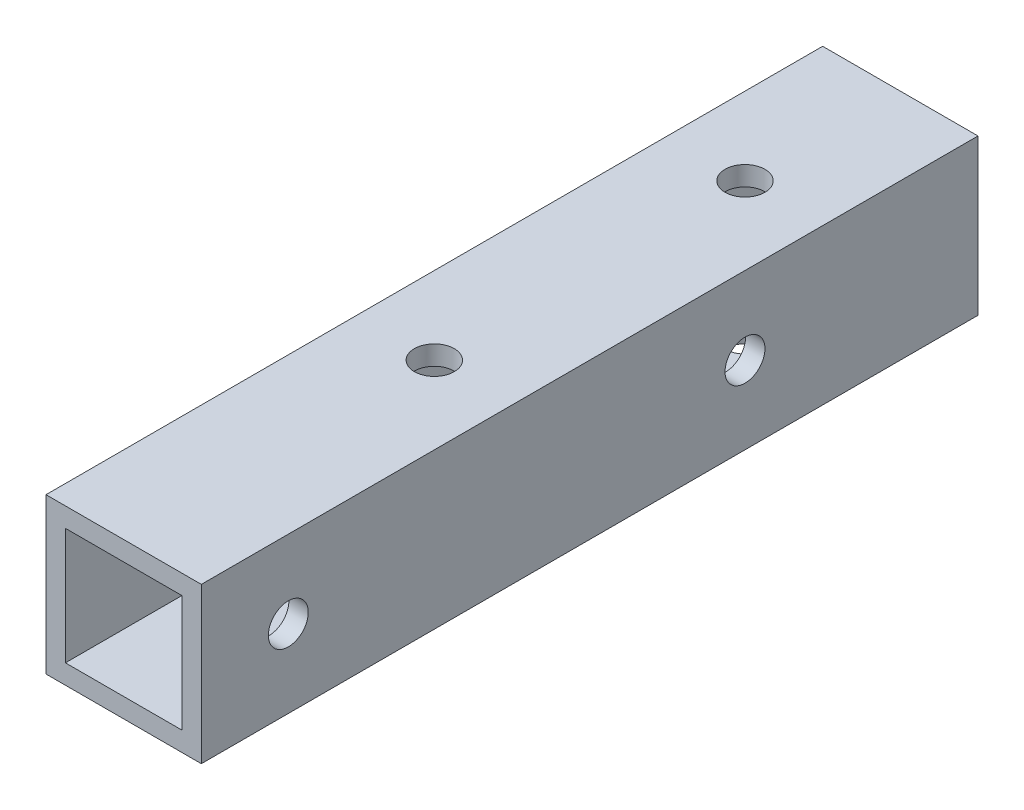
ISO-10303-21;
HEADER;
FILE_DESCRIPTION(('STEP AP214'),'2;1');
FILE_NAME('part.step','',(''),(''),'','','');
FILE_SCHEMA(('AUTOMOTIVE_DESIGN { 1 0 10303 214 1 1 1 1 }'));
ENDSEC;
DATA;
#1=APPLICATION_CONTEXT('core data for automotive mechanical design processes');
#2=APPLICATION_PROTOCOL_DEFINITION('international standard','automotive_design',2000,#1);
#3=PRODUCT_CONTEXT('',#1,'mechanical');
#4=PRODUCT('Part','Part','',(#3));
#5=PRODUCT_RELATED_PRODUCT_CATEGORY('part','',(#4));
#6=PRODUCT_DEFINITION_FORMATION('','',#4);
#7=PRODUCT_DEFINITION_CONTEXT('part definition',#1,'design');
#8=PRODUCT_DEFINITION('design','',#6,#7);
#9=PRODUCT_DEFINITION_SHAPE('','',#8);
#10=(LENGTH_UNIT() NAMED_UNIT(*) SI_UNIT(.MILLI.,.METRE.));
#11=(NAMED_UNIT(*) PLANE_ANGLE_UNIT() SI_UNIT($,.RADIAN.));
#12=(NAMED_UNIT(*) SI_UNIT($,.STERADIAN.) SOLID_ANGLE_UNIT());
#13=UNCERTAINTY_MEASURE_WITH_UNIT(LENGTH_MEASURE(1.E-05),#10,'distance_accuracy_value','');
#14=(GEOMETRIC_REPRESENTATION_CONTEXT(3) GLOBAL_UNCERTAINTY_ASSIGNED_CONTEXT((#13)) GLOBAL_UNIT_ASSIGNED_CONTEXT((#10,
#11,#12)) REPRESENTATION_CONTEXT('',''));
#15=CARTESIAN_POINT('',(0.,0.,0.));
#16=DIRECTION('',(0.,0.,1.));
#17=DIRECTION('',(1.,0.,0.));
#18=AXIS2_PLACEMENT_3D('',#15,#16,#17);
#19=CARTESIAN_POINT('',(0.,0.,127.));
#20=DIRECTION('',(0.,0.,-1.));
#21=DIRECTION('',(-1.,0.,0.));
#22=AXIS2_PLACEMENT_3D('',#19,#20,#21);
#23=PLANE('',#22);
#24=DIRECTION('',(-1.,0.,0.));
#25=VECTOR('',#24,1.);
#26=CARTESIAN_POINT('',(12.7000000000001,-12.7,127.));
#27=LINE('',#26,#25);
#28=CARTESIAN_POINT('',(12.7000000000001,-12.7,127.));
#29=VERTEX_POINT('',#28);
#30=CARTESIAN_POINT('',(-12.6999999999999,-12.7,127.));
#31=VERTEX_POINT('',#30);
#32=EDGE_CURVE('E137',#29,#31,#27,.T.);
#33=ORIENTED_EDGE('',*,*,#32,.F.);
#34=DIRECTION('',(0.,1.,0.));
#35=VECTOR('',#34,1.);
#36=CARTESIAN_POINT('',(12.7000000000001,-12.7,127.));
#37=LINE('',#36,#35);
#38=CARTESIAN_POINT('',(12.7000000000001,12.7,127.));
#39=VERTEX_POINT('',#38);
#40=EDGE_CURVE('E146',#29,#39,#37,.T.);
#41=ORIENTED_EDGE('',*,*,#40,.T.);
#42=DIRECTION('',(-1.,0.,0.));
#43=VECTOR('',#42,1.);
#44=CARTESIAN_POINT('',(12.7000000000001,12.7,127.));
#45=LINE('',#44,#43);
#46=CARTESIAN_POINT('',(-12.6999999999999,12.7,127.));
#47=VERTEX_POINT('',#46);
#48=EDGE_CURVE('E144',#39,#47,#45,.T.);
#49=ORIENTED_EDGE('',*,*,#48,.T.);
#50=DIRECTION('',(0.,1.,0.));
#51=VECTOR('',#50,1.);
#52=CARTESIAN_POINT('',(-12.6999999999999,-12.7,127.));
#53=LINE('',#52,#51);
#54=EDGE_CURVE('E140',#31,#47,#53,.T.);
#55=ORIENTED_EDGE('',*,*,#54,.F.);
#56=EDGE_LOOP('',(#33,#41,#49,#55));
#57=FACE_BOUND('',#56,.T.);
#58=DIRECTION('',(0.,1.,0.));
#59=VECTOR('',#58,1.);
#60=CARTESIAN_POINT('',(9.52500000000005,-9.52499999999999,127.));
#61=LINE('',#60,#59);
#62=CARTESIAN_POINT('',(9.52500000000005,-9.52499999999999,127.));
#63=VERTEX_POINT('',#62);
#64=CARTESIAN_POINT('',(9.52500000000005,9.52499999999999,127.));
#65=VERTEX_POINT('',#64);
#66=EDGE_CURVE('E99',#63,#65,#61,.T.);
#67=ORIENTED_EDGE('',*,*,#66,.F.);
#68=DIRECTION('',(1.,0.,0.));
#69=VECTOR('',#68,1.);
#70=CARTESIAN_POINT('',(-9.52500000000006,-9.52499999999999,127.));
#71=LINE('',#70,#69);
#72=CARTESIAN_POINT('',(-9.52500000000006,-9.52499999999999,127.));
#73=VERTEX_POINT('',#72);
#74=EDGE_CURVE('E121',#73,#63,#71,.T.);
#75=ORIENTED_EDGE('',*,*,#74,.F.);
#76=DIRECTION('',(0.,-1.,0.));
#77=VECTOR('',#76,1.);
#78=CARTESIAN_POINT('',(-9.52500000000006,-9.52499999999999,127.));
#79=LINE('',#78,#77);
#80=CARTESIAN_POINT('',(-9.52500000000006,9.52499999999999,127.));
#81=VERTEX_POINT('',#80);
#82=EDGE_CURVE('E119',#81,#73,#79,.T.);
#83=ORIENTED_EDGE('',*,*,#82,.F.);
#84=DIRECTION('',(-1.,0.,0.));
#85=VECTOR('',#84,1.);
#86=CARTESIAN_POINT('',(-9.52500000000006,9.52499999999999,127.));
#87=LINE('',#86,#85);
#88=EDGE_CURVE('E107',#65,#81,#87,.T.);
#89=ORIENTED_EDGE('',*,*,#88,.F.);
#90=EDGE_LOOP('',(#67,#75,#83,#89));
#91=FACE_BOUND('',#90,.T.);
#92=ADVANCED_FACE('F33',(#57,#91),#23,.F.);
#93=CARTESIAN_POINT('',(0.,0.,0.));
#94=DIRECTION('',(0.,0.,-1.));
#95=DIRECTION('',(-1.,0.,0.));
#96=AXIS2_PLACEMENT_3D('',#93,#94,#95);
#97=PLANE('',#96);
#98=DIRECTION('',(-1.,0.,0.));
#99=VECTOR('',#98,1.);
#100=CARTESIAN_POINT('',(12.7000000000001,-12.7,0.));
#101=LINE('',#100,#99);
#102=CARTESIAN_POINT('',(12.7000000000001,-12.7,0.));
#103=VERTEX_POINT('',#102);
#104=CARTESIAN_POINT('',(-12.6999999999999,-12.7,0.));
#105=VERTEX_POINT('',#104);
#106=EDGE_CURVE('E115',#103,#105,#101,.T.);
#107=ORIENTED_EDGE('',*,*,#106,.T.);
#108=DIRECTION('',(0.,1.,0.));
#109=VECTOR('',#108,1.);
#110=CARTESIAN_POINT('',(-12.6999999999999,-12.7,0.));
#111=LINE('',#110,#109);
#112=CARTESIAN_POINT('',(-12.6999999999999,12.7,0.));
#113=VERTEX_POINT('',#112);
#114=EDGE_CURVE('E151',#105,#113,#111,.T.);
#115=ORIENTED_EDGE('',*,*,#114,.T.);
#116=DIRECTION('',(-1.,0.,0.));
#117=VECTOR('',#116,1.);
#118=CARTESIAN_POINT('',(12.7000000000001,12.7,0.));
#119=LINE('',#118,#117);
#120=CARTESIAN_POINT('',(12.7000000000001,12.7,0.));
#121=VERTEX_POINT('',#120);
#122=EDGE_CURVE('E154',#121,#113,#119,.T.);
#123=ORIENTED_EDGE('',*,*,#122,.F.);
#124=DIRECTION('',(0.,1.,0.));
#125=VECTOR('',#124,1.);
#126=CARTESIAN_POINT('',(12.7000000000001,-12.7,0.));
#127=LINE('',#126,#125);
#128=EDGE_CURVE('E141',#103,#121,#127,.T.);
#129=ORIENTED_EDGE('',*,*,#128,.F.);
#130=EDGE_LOOP('',(#107,#115,#123,#129));
#131=FACE_BOUND('',#130,.T.);
#132=DIRECTION('',(1.,0.,0.));
#133=VECTOR('',#132,1.);
#134=CARTESIAN_POINT('',(-9.52500000000006,-9.52499999999999,0.));
#135=LINE('',#134,#133);
#136=CARTESIAN_POINT('',(-9.52500000000006,-9.52499999999999,0.));
#137=VERTEX_POINT('',#136);
#138=CARTESIAN_POINT('',(9.52500000000005,-9.52499999999999,0.));
#139=VERTEX_POINT('',#138);
#140=EDGE_CURVE('E108',#137,#139,#135,.T.);
#141=ORIENTED_EDGE('',*,*,#140,.T.);
#142=DIRECTION('',(0.,1.,0.));
#143=VECTOR('',#142,1.);
#144=CARTESIAN_POINT('',(9.52500000000005,-9.52499999999999,0.));
#145=LINE('',#144,#143);
#146=CARTESIAN_POINT('',(9.52500000000005,9.52499999999999,0.));
#147=VERTEX_POINT('',#146);
#148=EDGE_CURVE('E58',#139,#147,#145,.T.);
#149=ORIENTED_EDGE('',*,*,#148,.T.);
#150=DIRECTION('',(-1.,0.,0.));
#151=VECTOR('',#150,1.);
#152=CARTESIAN_POINT('',(-9.52500000000006,9.52499999999999,0.));
#153=LINE('',#152,#151);
#154=CARTESIAN_POINT('',(-9.52500000000006,9.52499999999999,0.));
#155=VERTEX_POINT('',#154);
#156=EDGE_CURVE('E114',#147,#155,#153,.T.);
#157=ORIENTED_EDGE('',*,*,#156,.T.);
#158=DIRECTION('',(0.,-1.,0.));
#159=VECTOR('',#158,1.);
#160=CARTESIAN_POINT('',(-9.52500000000006,-9.52499999999999,0.));
#161=LINE('',#160,#159);
#162=EDGE_CURVE('E129',#155,#137,#161,.T.);
#163=ORIENTED_EDGE('',*,*,#162,.T.);
#164=EDGE_LOOP('',(#141,#149,#157,#163));
#165=FACE_BOUND('',#164,.T.);
#166=ADVANCED_FACE('F216',(#131,#165),#97,.T.);
#167=CARTESIAN_POINT('',(12.7000000000001,-12.7,127.));
#168=DIRECTION('',(0.,-1.,0.));
#169=DIRECTION('',(0.,0.,-1.));
#170=AXIS2_PLACEMENT_3D('',#167,#168,#169);
#171=PLANE('',#170);
#172=CARTESIAN_POINT('',(0.,-12.7,76.2));
#173=DIRECTION('',(0.,1.,0.));
#174=DIRECTION('',(0.,0.,1.));
#175=AXIS2_PLACEMENT_3D('',#172,#173,#174);
#176=CIRCLE('',#175,3.2639);
#177=CARTESIAN_POINT('',(0.,-12.7,79.4639));
#178=VERTEX_POINT('',#177);
#179=EDGE_CURVE('E171',#178,#178,#176,.T.);
#180=ORIENTED_EDGE('',*,*,#179,.T.);
#181=EDGE_LOOP('',(#180));
#182=FACE_BOUND('',#181,.T.);
#183=CARTESIAN_POINT('',(0.,-12.7,25.4));
#184=DIRECTION('',(0.,-1.,0.));
#185=DIRECTION('',(0.,0.,-1.));
#186=AXIS2_PLACEMENT_3D('',#183,#184,#185);
#187=CIRCLE('',#186,3.2639);
#188=CARTESIAN_POINT('',(0.,-12.7,28.6639));
#189=VERTEX_POINT('',#188);
#190=EDGE_CURVE('E127',#189,#189,#187,.T.);
#191=ORIENTED_EDGE('',*,*,#190,.F.);
#192=EDGE_LOOP('',(#191));
#193=FACE_BOUND('',#192,.T.);
#194=ORIENTED_EDGE('',*,*,#106,.F.);
#195=DIRECTION('',(0.,0.,-1.));
#196=VECTOR('',#195,1.);
#197=CARTESIAN_POINT('',(12.7000000000001,-12.7,127.));
#198=LINE('',#197,#196);
#199=EDGE_CURVE('E11',#29,#103,#198,.T.);
#200=ORIENTED_EDGE('',*,*,#199,.F.);
#201=ORIENTED_EDGE('',*,*,#32,.T.);
#202=DIRECTION('',(0.,0.,-1.));
#203=VECTOR('',#202,1.);
#204=CARTESIAN_POINT('',(-12.6999999999999,-12.7,127.));
#205=LINE('',#204,#203);
#206=EDGE_CURVE('E148',#31,#105,#205,.T.);
#207=ORIENTED_EDGE('',*,*,#206,.T.);
#208=EDGE_LOOP('',(#194,#200,#201,#207));
#209=FACE_BOUND('',#208,.T.);
#210=ADVANCED_FACE('F35',(#182,#193,#209),#171,.T.);
#211=CARTESIAN_POINT('',(12.7000000000001,-12.7,127.));
#212=DIRECTION('',(-1.,0.,0.));
#213=DIRECTION('',(0.,0.,1.));
#214=AXIS2_PLACEMENT_3D('',#211,#212,#213);
#215=PLANE('',#214);
#216=CARTESIAN_POINT('',(12.7000000000001,0.,38.1));
#217=DIRECTION('',(-1.,0.,0.));
#218=DIRECTION('',(0.,0.,1.));
#219=AXIS2_PLACEMENT_3D('',#216,#217,#218);
#220=CIRCLE('',#219,3.2639);
#221=CARTESIAN_POINT('',(12.7000000000001,0.,41.3639));
#222=VERTEX_POINT('',#221);
#223=EDGE_CURVE('E175',#222,#222,#220,.T.);
#224=ORIENTED_EDGE('',*,*,#223,.T.);
#225=EDGE_LOOP('',(#224));
#226=FACE_BOUND('',#225,.T.);
#227=CARTESIAN_POINT('',(12.7000000000001,0.,112.776));
#228=DIRECTION('',(-1.,0.,0.));
#229=DIRECTION('',(0.,0.,1.));
#230=AXIS2_PLACEMENT_3D('',#227,#228,#229);
#231=CIRCLE('',#230,3.26389999999999);
#232=CARTESIAN_POINT('',(12.7000000000001,0.,116.0399));
#233=VERTEX_POINT('',#232);
#234=EDGE_CURVE('E186',#233,#233,#231,.T.);
#235=ORIENTED_EDGE('',*,*,#234,.T.);
#236=EDGE_LOOP('',(#235));
#237=FACE_BOUND('',#236,.T.);
#238=ORIENTED_EDGE('',*,*,#128,.T.);
#239=DIRECTION('',(0.,0.,-1.));
#240=VECTOR('',#239,1.);
#241=CARTESIAN_POINT('',(12.7000000000001,12.7,127.));
#242=LINE('',#241,#240);
#243=EDGE_CURVE('E42',#39,#121,#242,.T.);
#244=ORIENTED_EDGE('',*,*,#243,.F.);
#245=ORIENTED_EDGE('',*,*,#40,.F.);
#246=ORIENTED_EDGE('',*,*,#199,.T.);
#247=EDGE_LOOP('',(#238,#244,#245,#246));
#248=FACE_BOUND('',#247,.T.);
#249=ADVANCED_FACE('F215',(#226,#237,#248),#215,.F.);
#250=CARTESIAN_POINT('',(12.7000000000001,12.7,127.));
#251=DIRECTION('',(0.,-1.,0.));
#252=DIRECTION('',(0.,0.,-1.));
#253=AXIS2_PLACEMENT_3D('',#250,#251,#252);
#254=PLANE('',#253);
#255=CARTESIAN_POINT('',(0.,12.7,76.2));
#256=DIRECTION('',(0.,1.,0.));
#257=DIRECTION('',(0.,0.,1.));
#258=AXIS2_PLACEMENT_3D('',#255,#256,#257);
#259=CIRCLE('',#258,3.2639);
#260=CARTESIAN_POINT('',(0.,12.7,79.4639));
#261=VERTEX_POINT('',#260);
#262=EDGE_CURVE('E197',#261,#261,#259,.T.);
#263=ORIENTED_EDGE('',*,*,#262,.F.);
#264=EDGE_LOOP('',(#263));
#265=FACE_BOUND('',#264,.T.);
#266=CARTESIAN_POINT('',(0.,12.7,25.4));
#267=DIRECTION('',(0.,1.,0.));
#268=DIRECTION('',(0.,0.,1.));
#269=AXIS2_PLACEMENT_3D('',#266,#267,#268);
#270=CIRCLE('',#269,3.2639);
#271=CARTESIAN_POINT('',(0.,12.7,28.6639));
#272=VERTEX_POINT('',#271);
#273=EDGE_CURVE('E167',#272,#272,#270,.T.);
#274=ORIENTED_EDGE('',*,*,#273,.F.);
#275=EDGE_LOOP('',(#274));
#276=FACE_BOUND('',#275,.T.);
#277=ORIENTED_EDGE('',*,*,#122,.T.);
#278=DIRECTION('',(0.,0.,-1.));
#279=VECTOR('',#278,1.);
#280=CARTESIAN_POINT('',(-12.6999999999999,12.7,127.));
#281=LINE('',#280,#279);
#282=EDGE_CURVE('E160',#47,#113,#281,.T.);
#283=ORIENTED_EDGE('',*,*,#282,.F.);
#284=ORIENTED_EDGE('',*,*,#48,.F.);
#285=ORIENTED_EDGE('',*,*,#243,.T.);
#286=EDGE_LOOP('',(#277,#283,#284,#285));
#287=FACE_BOUND('',#286,.T.);
#288=ADVANCED_FACE('F229',(#265,#276,#287),#254,.F.);
#289=CARTESIAN_POINT('',(-12.6999999999999,-12.7,127.));
#290=DIRECTION('',(-1.,0.,0.));
#291=DIRECTION('',(0.,0.,1.));
#292=AXIS2_PLACEMENT_3D('',#289,#290,#291);
#293=PLANE('',#292);
#294=CARTESIAN_POINT('',(-12.6999999999999,0.,38.1));
#295=DIRECTION('',(-1.,0.,0.));
#296=DIRECTION('',(0.,0.,1.));
#297=AXIS2_PLACEMENT_3D('',#294,#295,#296);
#298=CIRCLE('',#297,3.2639);
#299=CARTESIAN_POINT('',(-12.6999999999999,0.,41.3639));
#300=VERTEX_POINT('',#299);
#301=EDGE_CURVE('E181',#300,#300,#298,.T.);
#302=ORIENTED_EDGE('',*,*,#301,.F.);
#303=EDGE_LOOP('',(#302));
#304=FACE_BOUND('',#303,.T.);
#305=CARTESIAN_POINT('',(-12.6999999999999,0.,112.776));
#306=DIRECTION('',(-1.,0.,0.));
#307=DIRECTION('',(0.,0.,1.));
#308=AXIS2_PLACEMENT_3D('',#305,#306,#307);
#309=CIRCLE('',#308,3.26389999999999);
#310=CARTESIAN_POINT('',(-12.6999999999999,0.,116.0399));
#311=VERTEX_POINT('',#310);
#312=EDGE_CURVE('E191',#311,#311,#309,.T.);
#313=ORIENTED_EDGE('',*,*,#312,.F.);
#314=EDGE_LOOP('',(#313));
#315=FACE_BOUND('',#314,.T.);
#316=ORIENTED_EDGE('',*,*,#114,.F.);
#317=ORIENTED_EDGE('',*,*,#206,.F.);
#318=ORIENTED_EDGE('',*,*,#54,.T.);
#319=ORIENTED_EDGE('',*,*,#282,.T.);
#320=EDGE_LOOP('',(#316,#317,#318,#319));
#321=FACE_BOUND('',#320,.T.);
#322=ADVANCED_FACE('F235',(#304,#315,#321),#293,.T.);
#323=CARTESIAN_POINT('',(9.52500000000005,-9.52499999999999,127.));
#324=DIRECTION('',(-1.,0.,0.));
#325=DIRECTION('',(0.,0.,1.));
#326=AXIS2_PLACEMENT_3D('',#323,#324,#325);
#327=PLANE('',#326);
#328=CARTESIAN_POINT('',(9.52500000000005,0.,38.1));
#329=DIRECTION('',(-1.,0.,0.));
#330=DIRECTION('',(0.,0.,1.));
#331=AXIS2_PLACEMENT_3D('',#328,#329,#330);
#332=CIRCLE('',#331,3.2639);
#333=CARTESIAN_POINT('',(9.52500000000005,0.,41.3639));
#334=VERTEX_POINT('',#333);
#335=EDGE_CURVE('E194',#334,#334,#332,.T.);
#336=ORIENTED_EDGE('',*,*,#335,.F.);
#337=EDGE_LOOP('',(#336));
#338=FACE_BOUND('',#337,.T.);
#339=CARTESIAN_POINT('',(9.52500000000005,0.,112.776));
#340=DIRECTION('',(-1.,0.,0.));
#341=DIRECTION('',(0.,0.,1.));
#342=AXIS2_PLACEMENT_3D('',#339,#340,#341);
#343=CIRCLE('',#342,3.26389999999999);
#344=CARTESIAN_POINT('',(9.52500000000005,0.,116.0399));
#345=VERTEX_POINT('',#344);
#346=EDGE_CURVE('E174',#345,#345,#343,.T.);
#347=ORIENTED_EDGE('',*,*,#346,.F.);
#348=EDGE_LOOP('',(#347));
#349=FACE_BOUND('',#348,.T.);
#350=ORIENTED_EDGE('',*,*,#148,.F.);
#351=DIRECTION('',(0.,0.,-1.));
#352=VECTOR('',#351,1.);
#353=CARTESIAN_POINT('',(9.52500000000005,-9.52499999999999,127.));
#354=LINE('',#353,#352);
#355=EDGE_CURVE('E103',#63,#139,#354,.T.);
#356=ORIENTED_EDGE('',*,*,#355,.F.);
#357=ORIENTED_EDGE('',*,*,#66,.T.);
#358=DIRECTION('',(0.,0.,-1.));
#359=VECTOR('',#358,1.);
#360=CARTESIAN_POINT('',(9.52500000000005,9.52499999999999,127.));
#361=LINE('',#360,#359);
#362=EDGE_CURVE('E102',#65,#147,#361,.T.);
#363=ORIENTED_EDGE('',*,*,#362,.T.);
#364=EDGE_LOOP('',(#350,#356,#357,#363));
#365=FACE_BOUND('',#364,.T.);
#366=ADVANCED_FACE('F101',(#338,#349,#365),#327,.T.);
#367=CARTESIAN_POINT('',(-9.52500000000006,9.52499999999999,127.));
#368=DIRECTION('',(0.,-1.,0.));
#369=DIRECTION('',(0.,0.,-1.));
#370=AXIS2_PLACEMENT_3D('',#367,#368,#369);
#371=PLANE('',#370);
#372=CARTESIAN_POINT('',(0.,9.52499999999999,76.2));
#373=DIRECTION('',(0.,-1.,0.));
#374=DIRECTION('',(0.,0.,-1.));
#375=AXIS2_PLACEMENT_3D('',#372,#373,#374);
#376=CIRCLE('',#375,3.2639);
#377=CARTESIAN_POINT('',(0.,9.52499999999999,72.9361));
#378=VERTEX_POINT('',#377);
#379=EDGE_CURVE('E170',#378,#378,#376,.T.);
#380=ORIENTED_EDGE('',*,*,#379,.F.);
#381=EDGE_LOOP('',(#380));
#382=FACE_BOUND('',#381,.T.);
#383=CARTESIAN_POINT('',(0.,9.52500000000001,25.4));
#384=DIRECTION('',(0.,-1.,0.));
#385=DIRECTION('',(0.,0.,-1.));
#386=AXIS2_PLACEMENT_3D('',#383,#384,#385);
#387=CIRCLE('',#386,3.2639);
#388=CARTESIAN_POINT('',(0.,9.52500000000006,28.6639));
#389=VERTEX_POINT('',#388);
#390=EDGE_CURVE('E166',#389,#389,#387,.T.);
#391=ORIENTED_EDGE('',*,*,#390,.F.);
#392=EDGE_LOOP('',(#391));
#393=FACE_BOUND('',#392,.T.);
#394=ORIENTED_EDGE('',*,*,#156,.F.);
#395=ORIENTED_EDGE('',*,*,#362,.F.);
#396=ORIENTED_EDGE('',*,*,#88,.T.);
#397=DIRECTION('',(0.,0.,-1.));
#398=VECTOR('',#397,1.);
#399=CARTESIAN_POINT('',(-9.52500000000006,9.52499999999999,127.));
#400=LINE('',#399,#398);
#401=EDGE_CURVE('E116',#81,#155,#400,.T.);
#402=ORIENTED_EDGE('',*,*,#401,.T.);
#403=EDGE_LOOP('',(#394,#395,#396,#402));
#404=FACE_BOUND('',#403,.T.);
#405=ADVANCED_FACE('F111',(#382,#393,#404),#371,.T.);
#406=CARTESIAN_POINT('',(-9.52500000000006,-9.52499999999999,127.));
#407=DIRECTION('',(1.,0.,0.));
#408=DIRECTION('',(0.,0.,-1.));
#409=AXIS2_PLACEMENT_3D('',#406,#407,#408);
#410=PLANE('',#409);
#411=CARTESIAN_POINT('',(-9.52500000000006,0.,38.1));
#412=DIRECTION('',(1.,0.,0.));
#413=DIRECTION('',(0.,0.,-1.));
#414=AXIS2_PLACEMENT_3D('',#411,#412,#413);
#415=CIRCLE('',#414,3.2639);
#416=CARTESIAN_POINT('',(-9.52500000000006,0.,34.8361));
#417=VERTEX_POINT('',#416);
#418=EDGE_CURVE('E37',#417,#417,#415,.T.);
#419=ORIENTED_EDGE('',*,*,#418,.F.);
#420=EDGE_LOOP('',(#419));
#421=FACE_BOUND('',#420,.T.);
#422=CARTESIAN_POINT('',(-9.52500000000006,0.,112.776));
#423=DIRECTION('',(1.,0.,0.));
#424=DIRECTION('',(0.,0.,-1.));
#425=AXIS2_PLACEMENT_3D('',#422,#423,#424);
#426=CIRCLE('',#425,3.26389999999999);
#427=CARTESIAN_POINT('',(-9.52500000000006,0.,109.5121));
#428=VERTEX_POINT('',#427);
#429=EDGE_CURVE('E172',#428,#428,#426,.T.);
#430=ORIENTED_EDGE('',*,*,#429,.F.);
#431=EDGE_LOOP('',(#430));
#432=FACE_BOUND('',#431,.T.);
#433=ORIENTED_EDGE('',*,*,#162,.F.);
#434=ORIENTED_EDGE('',*,*,#401,.F.);
#435=ORIENTED_EDGE('',*,*,#82,.T.);
#436=DIRECTION('',(0.,0.,-1.));
#437=VECTOR('',#436,1.);
#438=CARTESIAN_POINT('',(-9.52500000000006,-9.52499999999999,127.));
#439=LINE('',#438,#437);
#440=EDGE_CURVE('E50',#73,#137,#439,.T.);
#441=ORIENTED_EDGE('',*,*,#440,.T.);
#442=EDGE_LOOP('',(#433,#434,#435,#441));
#443=FACE_BOUND('',#442,.T.);
#444=ADVANCED_FACE('F298',(#421,#432,#443),#410,.T.);
#445=CARTESIAN_POINT('',(-9.52500000000006,-9.52499999999999,127.));
#446=DIRECTION('',(0.,1.,0.));
#447=DIRECTION('',(0.,0.,1.));
#448=AXIS2_PLACEMENT_3D('',#445,#446,#447);
#449=PLANE('',#448);
#450=CARTESIAN_POINT('',(0.,-9.52499999999999,76.2));
#451=DIRECTION('',(0.,1.,0.));
#452=DIRECTION('',(0.,0.,1.));
#453=AXIS2_PLACEMENT_3D('',#450,#451,#452);
#454=CIRCLE('',#453,3.2639);
#455=CARTESIAN_POINT('',(0.,-9.52499999999999,79.4639));
#456=VERTEX_POINT('',#455);
#457=EDGE_CURVE('E168',#456,#456,#454,.T.);
#458=ORIENTED_EDGE('',*,*,#457,.F.);
#459=EDGE_LOOP('',(#458));
#460=FACE_BOUND('',#459,.T.);
#461=CARTESIAN_POINT('',(0.,-9.52500000000001,25.4));
#462=DIRECTION('',(0.,1.,0.));
#463=DIRECTION('',(0.,0.,1.));
#464=AXIS2_PLACEMENT_3D('',#461,#462,#463);
#465=CIRCLE('',#464,3.2639);
#466=CARTESIAN_POINT('',(0.,-9.52500000000006,28.6639));
#467=VERTEX_POINT('',#466);
#468=EDGE_CURVE('E163',#467,#467,#465,.T.);
#469=ORIENTED_EDGE('',*,*,#468,.F.);
#470=EDGE_LOOP('',(#469));
#471=FACE_BOUND('',#470,.T.);
#472=ORIENTED_EDGE('',*,*,#140,.F.);
#473=ORIENTED_EDGE('',*,*,#440,.F.);
#474=ORIENTED_EDGE('',*,*,#74,.T.);
#475=ORIENTED_EDGE('',*,*,#355,.T.);
#476=EDGE_LOOP('',(#472,#473,#474,#475));
#477=FACE_BOUND('',#476,.T.);
#478=ADVANCED_FACE('F295',(#460,#471,#477),#449,.T.);
#479=CARTESIAN_POINT('',(0.,-292.1,25.4));
#480=DIRECTION('',(0.,1.,0.));
#481=DIRECTION('',(0.,0.,1.));
#482=AXIS2_PLACEMENT_3D('',#479,#480,#481);
#483=CYLINDRICAL_SURFACE('',#482,3.2639);
#484=CARTESIAN_POINT('',(0.,-12.7,28.6639));
#485=CARTESIAN_POINT('',(0.,-12.6669270833333,28.6639));
#486=CARTESIAN_POINT('',(0.,-12.6338541666666,28.6639));
#487=CARTESIAN_POINT('',(0.,-12.5677083333333,28.6639));
#488=CARTESIAN_POINT('',(0.,-12.5346354166667,28.6639));
#489=CARTESIAN_POINT('',(0.,-12.4684895833333,28.6639));
#490=CARTESIAN_POINT('',(0.,-12.4354166666667,28.6639));
#491=CARTESIAN_POINT('',(0.,-12.3692708333333,28.6639));
#492=CARTESIAN_POINT('',(0.,-12.3361979166667,28.6639));
#493=CARTESIAN_POINT('',(0.,-12.2700520833334,28.6639));
#494=CARTESIAN_POINT('',(0.,-12.2369791666667,28.6639));
#495=CARTESIAN_POINT('',(0.,-12.1708333333333,28.6639));
#496=CARTESIAN_POINT('',(0.,-12.1377604166667,28.6639));
#497=CARTESIAN_POINT('',(0.,-12.0716145833333,28.6639));
#498=CARTESIAN_POINT('',(0.,-12.0385416666667,28.6639));
#499=CARTESIAN_POINT('',(0.,-11.9723958333334,28.6639));
#500=CARTESIAN_POINT('',(0.,-11.9393229166667,28.6639));
#501=CARTESIAN_POINT('',(0.,-11.8731770833333,28.6639));
#502=CARTESIAN_POINT('',(0.,-11.8401041666667,28.6639));
#503=CARTESIAN_POINT('',(0.,-11.7739583333333,28.6639));
#504=CARTESIAN_POINT('',(0.,-11.7408854166667,28.6639));
#505=CARTESIAN_POINT('',(0.,-11.6747395833334,28.6639));
#506=CARTESIAN_POINT('',(0.,-11.6416666666667,28.6639));
#507=CARTESIAN_POINT('',(0.,-11.5755208333333,28.6639));
#508=CARTESIAN_POINT('',(0.,-11.5424479166667,28.6639));
#509=CARTESIAN_POINT('',(0.,-11.4763020833333,28.6639));
#510=CARTESIAN_POINT('',(0.,-11.4432291666667,28.6639));
#511=CARTESIAN_POINT('',(0.,-11.3770833333334,28.6639));
#512=CARTESIAN_POINT('',(0.,-11.3440104166667,28.6639));
#513=CARTESIAN_POINT('',(0.,-11.2778645833334,28.6639));
#514=CARTESIAN_POINT('',(0.,-11.2447916666667,28.6639));
#515=CARTESIAN_POINT('',(0.,-11.1786458333334,28.6639));
#516=CARTESIAN_POINT('',(0.,-11.1455729166667,28.6639));
#517=CARTESIAN_POINT('',(0.,-11.0794270833334,28.6639));
#518=CARTESIAN_POINT('',(0.,-11.0463541666667,28.6639));
#519=CARTESIAN_POINT('',(0.,-10.9802083333334,28.6639));
#520=CARTESIAN_POINT('',(0.,-10.9471354166667,28.6639));
#521=CARTESIAN_POINT('',(0.,-10.8809895833334,28.6639));
#522=CARTESIAN_POINT('',(0.,-10.8479166666667,28.6639));
#523=CARTESIAN_POINT('',(0.,-10.7817708333334,28.6639));
#524=CARTESIAN_POINT('',(0.,-10.7486979166667,28.6639));
#525=CARTESIAN_POINT('',(0.,-10.6825520833334,28.6639));
#526=CARTESIAN_POINT('',(0.,-10.6494791666667,28.6639));
#527=CARTESIAN_POINT('',(0.,-10.5833333333334,28.6639));
#528=CARTESIAN_POINT('',(0.,-10.5502604166667,28.6639));
#529=CARTESIAN_POINT('',(0.,-10.4841145833334,28.6639));
#530=CARTESIAN_POINT('',(0.,-10.4510416666667,28.6639));
#531=CARTESIAN_POINT('',(0.,-10.3848958333334,28.6639));
#532=CARTESIAN_POINT('',(0.,-10.3518229166667,28.6639));
#533=CARTESIAN_POINT('',(0.,-10.2856770833334,28.6639));
#534=CARTESIAN_POINT('',(0.,-10.2526041666667,28.6639));
#535=CARTESIAN_POINT('',(0.,-10.1864583333334,28.6639));
#536=CARTESIAN_POINT('',(0.,-10.1533854166667,28.6639));
#537=CARTESIAN_POINT('',(0.,-10.0872395833334,28.6639));
#538=CARTESIAN_POINT('',(0.,-10.0541666666667,28.6639));
#539=CARTESIAN_POINT('',(0.,-9.98802083333337,28.6639));
#540=CARTESIAN_POINT('',(0.,-9.9549479166667,28.6639));
#541=CARTESIAN_POINT('',(0.,-9.88880208333337,28.6639));
#542=CARTESIAN_POINT('',(0.,-9.85572916666672,28.6639));
#543=CARTESIAN_POINT('',(0.,-9.78958333333339,28.6639));
#544=CARTESIAN_POINT('',(0.,-9.75651041666672,28.6639));
#545=CARTESIAN_POINT('',(0.,-9.69036458333339,28.6639));
#546=CARTESIAN_POINT('',(0.,-9.65729166666673,28.6639));
#547=CARTESIAN_POINT('',(0.,-9.59114583333341,28.6639));
#548=CARTESIAN_POINT('',(0.,-9.55807291666673,28.6639));
#549=CARTESIAN_POINT('',(0.,-9.52500000000006,28.6639));
#550=B_SPLINE_CURVE_WITH_KNOTS('',3,(#484,#485,#486,#487,#488,#489,#490,#491,#492,#493,#494,
#495,#496,#497,#498,#499,#500,#501,#502,#503,#504,#505,#506,#507,#508,#509,#510,#511,#512,#513,
#514,#515,#516,#517,#518,#519,#520,#521,#522,#523,#524,#525,#526,#527,#528,#529,#530,#531,#532,
#533,#534,#535,#536,#537,#538,#539,#540,#541,#542,#543,#544,#545,#546,#547,#548,#549),
.UNSPECIFIED.,.F.,.F.,(4,2,2,2,2,2,2,2,2,2,2,2,2,2,2,2,2,2,2,2,2,2,2,2,2,2,2,2,2,2,2,2,4),(0.,
0.0992187500000186,0.198437499999982,0.29765625,0.396874999999963,0.496093749999982,0.5953125,
0.694531249999963,0.793749999999982,0.892968750000001,0.992187499999964,1.09140624999998,
1.190625,1.28984374999996,1.38906249999998,1.48828124999995,1.58749999999996,1.68671874999998,
1.78593749999995,1.88515624999996,1.98437499999993,2.08359374999995,2.18281249999996,
2.28203124999993,2.38124999999995,2.48046874999996,2.57968749999993,2.67890624999995,
2.77812499999996,2.87734374999993,2.97656249999995,3.07578124999991,3.17499999999993),.UNSPECIFIED.);
#551=EDGE_CURVE('BSEAM210',#189,#467,#550,.T.);
#552=ORIENTED_EDGE('',*,*,#190,.T.);
#553=ORIENTED_EDGE('',*,*,#468,.T.);
#554=ORIENTED_EDGE('',*,*,#551,.T.);
#555=ORIENTED_EDGE('',*,*,#551,.F.);
#556=EDGE_LOOP('',(#552,#554,#553,#555));
#557=FACE_BOUND('',#556,.T.);
#558=ADVANCED_FACE('F210',(#557),#483,.F.);
#559=CARTESIAN_POINT('',(0.,9.52500000000006,28.6639));
#560=CARTESIAN_POINT('',(0.,9.55807291666673,28.6639));
#561=CARTESIAN_POINT('',(0.,9.59114583333341,28.6639));
#562=CARTESIAN_POINT('',(0.,9.65729166666673,28.6639));
#563=CARTESIAN_POINT('',(0.,9.69036458333339,28.6639));
#564=CARTESIAN_POINT('',(0.,9.75651041666672,28.6639));
#565=CARTESIAN_POINT('',(0.,9.78958333333339,28.6639));
#566=CARTESIAN_POINT('',(0.,9.85572916666672,28.6639));
#567=CARTESIAN_POINT('',(0.,9.88880208333337,28.6639));
#568=CARTESIAN_POINT('',(0.,9.9549479166667,28.6639));
#569=CARTESIAN_POINT('',(0.,9.98802083333337,28.6639));
#570=CARTESIAN_POINT('',(0.,10.0541666666667,28.6639));
#571=CARTESIAN_POINT('',(0.,10.0872395833334,28.6639));
#572=CARTESIAN_POINT('',(0.,10.1533854166667,28.6639));
#573=CARTESIAN_POINT('',(0.,10.1864583333334,28.6639));
#574=CARTESIAN_POINT('',(0.,10.2526041666667,28.6639));
#575=CARTESIAN_POINT('',(0.,10.2856770833334,28.6639));
#576=CARTESIAN_POINT('',(0.,10.3518229166667,28.6639));
#577=CARTESIAN_POINT('',(0.,10.3848958333334,28.6639));
#578=CARTESIAN_POINT('',(0.,10.4510416666667,28.6639));
#579=CARTESIAN_POINT('',(0.,10.4841145833334,28.6639));
#580=CARTESIAN_POINT('',(0.,10.5502604166667,28.6639));
#581=CARTESIAN_POINT('',(0.,10.5833333333334,28.6639));
#582=CARTESIAN_POINT('',(0.,10.6494791666667,28.6639));
#583=CARTESIAN_POINT('',(0.,10.6825520833334,28.6639));
#584=CARTESIAN_POINT('',(0.,10.7486979166667,28.6639));
#585=CARTESIAN_POINT('',(0.,10.7817708333334,28.6639));
#586=CARTESIAN_POINT('',(0.,10.8479166666667,28.6639));
#587=CARTESIAN_POINT('',(0.,10.8809895833334,28.6639));
#588=CARTESIAN_POINT('',(0.,10.9471354166667,28.6639));
#589=CARTESIAN_POINT('',(0.,10.9802083333334,28.6639));
#590=CARTESIAN_POINT('',(0.,11.0463541666667,28.6639));
#591=CARTESIAN_POINT('',(0.,11.0794270833334,28.6639));
#592=CARTESIAN_POINT('',(0.,11.1455729166667,28.6639));
#593=CARTESIAN_POINT('',(0.,11.1786458333334,28.6639));
#594=CARTESIAN_POINT('',(0.,11.2447916666667,28.6639));
#595=CARTESIAN_POINT('',(0.,11.2778645833334,28.6639));
#596=CARTESIAN_POINT('',(0.,11.3440104166667,28.6639));
#597=CARTESIAN_POINT('',(0.,11.3770833333334,28.6639));
#598=CARTESIAN_POINT('',(0.,11.4432291666667,28.6639));
#599=CARTESIAN_POINT('',(0.,11.4763020833333,28.6639));
#600=CARTESIAN_POINT('',(0.,11.5424479166667,28.6639));
#601=CARTESIAN_POINT('',(0.,11.5755208333333,28.6639));
#602=CARTESIAN_POINT('',(0.,11.6416666666667,28.6639));
#603=CARTESIAN_POINT('',(0.,11.6747395833334,28.6639));
#604=CARTESIAN_POINT('',(0.,11.7408854166667,28.6639));
#605=CARTESIAN_POINT('',(0.,11.7739583333333,28.6639));
#606=CARTESIAN_POINT('',(0.,11.8401041666667,28.6639));
#607=CARTESIAN_POINT('',(0.,11.8731770833333,28.6639));
#608=CARTESIAN_POINT('',(0.,11.9393229166667,28.6639));
#609=CARTESIAN_POINT('',(0.,11.9723958333334,28.6639));
#610=CARTESIAN_POINT('',(0.,12.0385416666667,28.6639));
#611=CARTESIAN_POINT('',(0.,12.0716145833333,28.6639));
#612=CARTESIAN_POINT('',(0.,12.1377604166667,28.6639));
#613=CARTESIAN_POINT('',(0.,12.1708333333333,28.6639));
#614=CARTESIAN_POINT('',(0.,12.2369791666667,28.6639));
#615=CARTESIAN_POINT('',(0.,12.2700520833334,28.6639));
#616=CARTESIAN_POINT('',(0.,12.3361979166667,28.6639));
#617=CARTESIAN_POINT('',(0.,12.3692708333333,28.6639));
#618=CARTESIAN_POINT('',(0.,12.4354166666667,28.6639));
#619=CARTESIAN_POINT('',(0.,12.4684895833333,28.6639));
#620=CARTESIAN_POINT('',(0.,12.5346354166667,28.6639));
#621=CARTESIAN_POINT('',(0.,12.5677083333333,28.6639));
#622=CARTESIAN_POINT('',(0.,12.6338541666666,28.6639));
#623=CARTESIAN_POINT('',(0.,12.6669270833333,28.6639));
#624=CARTESIAN_POINT('',(0.,12.7,28.6639));
#625=B_SPLINE_CURVE_WITH_KNOTS('',3,(#559,#560,#561,#562,#563,#564,#565,#566,#567,#568,#569,
#570,#571,#572,#573,#574,#575,#576,#577,#578,#579,#580,#581,#582,#583,#584,#585,#586,#587,#588,
#589,#590,#591,#592,#593,#594,#595,#596,#597,#598,#599,#600,#601,#602,#603,#604,#605,#606,#607,
#608,#609,#610,#611,#612,#613,#614,#615,#616,#617,#618,#619,#620,#621,#622,#623,#624),
.UNSPECIFIED.,.F.,.F.,(4,2,2,2,2,2,2,2,2,2,2,2,2,2,2,2,2,2,2,2,2,2,2,2,2,2,2,2,2,2,2,2,4),(0.,
0.0992187500000186,0.198437499999982,0.29765625,0.396874999999963,0.496093749999982,0.5953125,
0.694531249999963,0.793749999999982,0.892968750000001,0.992187499999964,1.09140624999998,
1.190625,1.28984374999996,1.38906249999998,1.48828124999995,1.58749999999996,1.68671874999998,
1.78593749999995,1.88515624999996,1.98437499999993,2.08359374999995,2.18281249999996,
2.28203124999993,2.38124999999995,2.48046874999996,2.57968749999993,2.67890624999995,
2.77812499999996,2.87734374999993,2.97656249999995,3.07578124999991,3.17499999999993),.UNSPECIFIED.);
#626=EDGE_CURVE('BSEAM289',#389,#272,#625,.T.);
#627=ORIENTED_EDGE('',*,*,#390,.T.);
#628=ORIENTED_EDGE('',*,*,#273,.T.);
#629=ORIENTED_EDGE('',*,*,#626,.T.);
#630=ORIENTED_EDGE('',*,*,#626,.F.);
#631=EDGE_LOOP('',(#627,#629,#628,#630));
#632=FACE_BOUND('',#631,.T.);
#633=ADVANCED_FACE('F289',(#632),#483,.F.);
#634=CARTESIAN_POINT('',(0.,-12.7,76.2));
#635=DIRECTION('',(0.,1.,0.));
#636=DIRECTION('',(0.,0.,1.));
#637=AXIS2_PLACEMENT_3D('',#634,#635,#636);
#638=CYLINDRICAL_SURFACE('',#637,3.2639);
#639=ORIENTED_EDGE('',*,*,#457,.T.);
#640=EDGE_LOOP('',(#639));
#641=FACE_BOUND('',#640,.T.);
#642=ORIENTED_EDGE('',*,*,#179,.F.);
#643=EDGE_LOOP('',(#642));
#644=FACE_BOUND('',#643,.T.);
#645=ADVANCED_FACE('F282',(#641,#644),#638,.F.);
#646=ORIENTED_EDGE('',*,*,#379,.T.);
#647=EDGE_LOOP('',(#646));
#648=FACE_BOUND('',#647,.T.);
#649=ORIENTED_EDGE('',*,*,#262,.T.);
#650=EDGE_LOOP('',(#649));
#651=FACE_BOUND('',#650,.T.);
#652=ADVANCED_FACE('F278',(#648,#651),#638,.F.);
#653=CARTESIAN_POINT('',(12.7000000000001,0.,112.776));
#654=DIRECTION('',(-1.,0.,0.));
#655=DIRECTION('',(0.,0.,1.));
#656=AXIS2_PLACEMENT_3D('',#653,#654,#655);
#657=CYLINDRICAL_SURFACE('',#656,3.26389999999999);
#658=ORIENTED_EDGE('',*,*,#429,.T.);
#659=EDGE_LOOP('',(#658));
#660=FACE_BOUND('',#659,.T.);
#661=ORIENTED_EDGE('',*,*,#312,.T.);
#662=EDGE_LOOP('',(#661));
#663=FACE_BOUND('',#662,.T.);
#664=ADVANCED_FACE('F268',(#660,#663),#657,.F.);
#665=CARTESIAN_POINT('',(12.7000000000001,0.,38.1));
#666=DIRECTION('',(-1.,0.,0.));
#667=DIRECTION('',(0.,0.,1.));
#668=AXIS2_PLACEMENT_3D('',#665,#666,#667);
#669=CYLINDRICAL_SURFACE('',#668,3.2639);
#670=ORIENTED_EDGE('',*,*,#418,.T.);
#671=EDGE_LOOP('',(#670));
#672=FACE_BOUND('',#671,.T.);
#673=ORIENTED_EDGE('',*,*,#301,.T.);
#674=EDGE_LOOP('',(#673));
#675=FACE_BOUND('',#674,.T.);
#676=ADVANCED_FACE('F265',(#672,#675),#669,.F.);
#677=ORIENTED_EDGE('',*,*,#346,.T.);
#678=EDGE_LOOP('',(#677));
#679=FACE_BOUND('',#678,.T.);
#680=ORIENTED_EDGE('',*,*,#234,.F.);
#681=EDGE_LOOP('',(#680));
#682=FACE_BOUND('',#681,.T.);
#683=ADVANCED_FACE('F262',(#679,#682),#657,.F.);
#684=ORIENTED_EDGE('',*,*,#335,.T.);
#685=EDGE_LOOP('',(#684));
#686=FACE_BOUND('',#685,.T.);
#687=ORIENTED_EDGE('',*,*,#223,.F.);
#688=EDGE_LOOP('',(#687));
#689=FACE_BOUND('',#688,.T.);
#690=ADVANCED_FACE('F264',(#686,#689),#669,.F.);
#691=CLOSED_SHELL('',(#92,#166,#210,#249,#288,#322,#366,#405,#444,#478,#558,#633,#645,#652,#664,
#676,#683,#690));
#692=MANIFOLD_SOLID_BREP('B2',#691);
#693=ADVANCED_BREP_SHAPE_REPRESENTATION('',(#18,#692),#14);
#694=SHAPE_DEFINITION_REPRESENTATION(#9,#693);
ENDSEC;
END-ISO-10303-21;
